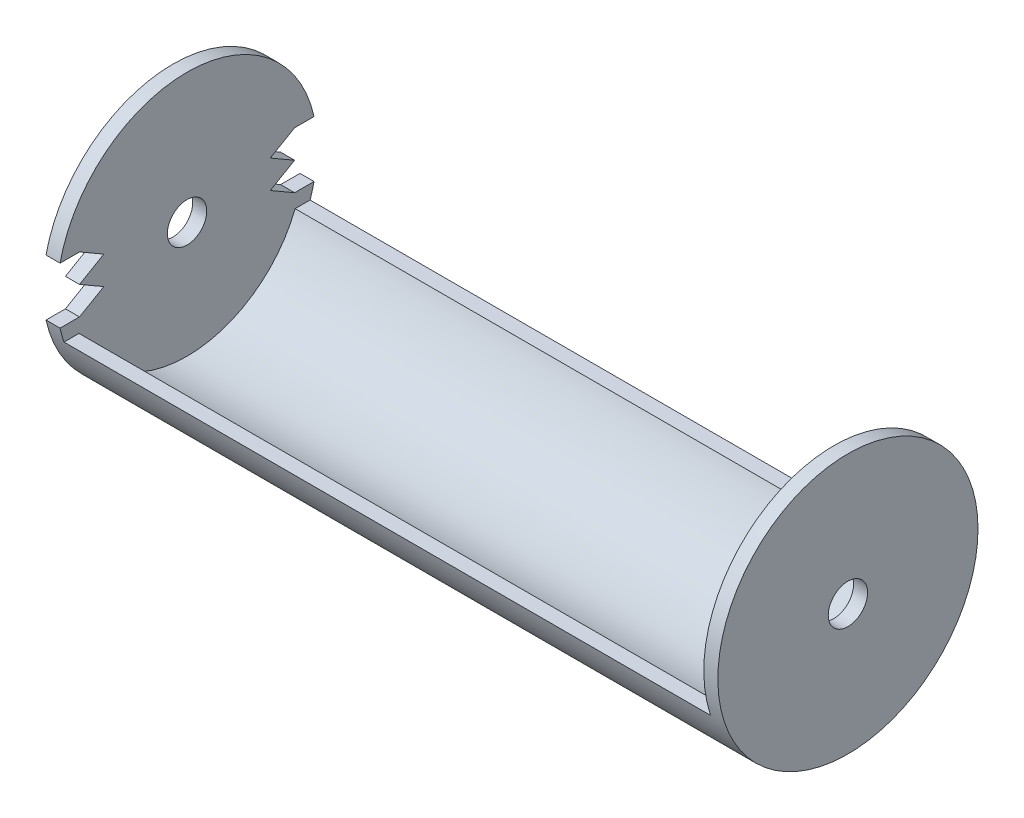
ISO-10303-21;
HEADER;
FILE_DESCRIPTION(('STEP AP214'),'2;1');
FILE_NAME('part.step','',(''),(''),'','','');
FILE_SCHEMA(('AUTOMOTIVE_DESIGN { 1 0 10303 214 1 1 1 1 }'));
ENDSEC;
DATA;
#1=APPLICATION_CONTEXT('core data for automotive mechanical design processes');
#2=APPLICATION_PROTOCOL_DEFINITION('international standard','automotive_design',2000,#1);
#3=PRODUCT_CONTEXT('',#1,'mechanical');
#4=PRODUCT('Part','Part','',(#3));
#5=PRODUCT_RELATED_PRODUCT_CATEGORY('part','',(#4));
#6=PRODUCT_DEFINITION_FORMATION('','',#4);
#7=PRODUCT_DEFINITION_CONTEXT('part definition',#1,'design');
#8=PRODUCT_DEFINITION('design','',#6,#7);
#9=PRODUCT_DEFINITION_SHAPE('','',#8);
#10=(LENGTH_UNIT() NAMED_UNIT(*) SI_UNIT(.MILLI.,.METRE.));
#11=(NAMED_UNIT(*) PLANE_ANGLE_UNIT() SI_UNIT($,.RADIAN.));
#12=(NAMED_UNIT(*) SI_UNIT($,.STERADIAN.) SOLID_ANGLE_UNIT());
#13=UNCERTAINTY_MEASURE_WITH_UNIT(LENGTH_MEASURE(1.E-05),#10,'distance_accuracy_value','');
#14=(GEOMETRIC_REPRESENTATION_CONTEXT(3) GLOBAL_UNCERTAINTY_ASSIGNED_CONTEXT((#13)) GLOBAL_UNIT_ASSIGNED_CONTEXT((#10,
#11,#12)) REPRESENTATION_CONTEXT('',''));
#15=CARTESIAN_POINT('',(0.,0.,0.));
#16=DIRECTION('',(0.,0.,1.));
#17=DIRECTION('',(1.,0.,0.));
#18=AXIS2_PLACEMENT_3D('',#15,#16,#17);
#19=CARTESIAN_POINT('',(-152.4,0.,0.));
#20=DIRECTION('',(1.,0.,0.));
#21=DIRECTION('',(0.,0.,-1.));
#22=AXIS2_PLACEMENT_3D('',#19,#20,#21);
#23=PLANE('',#22);
#24=CARTESIAN_POINT('',(-152.4,0.,0.));
#25=DIRECTION('',(1.,0.,0.));
#26=DIRECTION('',(0.,0.,-1.));
#27=AXIS2_PLACEMENT_3D('',#24,#25,#26);
#28=CIRCLE('',#27,8.89);
#29=CARTESIAN_POINT('',(-152.4,0.,8.89));
#30=VERTEX_POINT('',#29);
#31=EDGE_CURVE('E269',#30,#30,#28,.T.);
#32=ORIENTED_EDGE('',*,*,#31,.T.);
#33=EDGE_LOOP('',(#32));
#34=FACE_BOUND('',#33,.T.);
#35=DIRECTION('',(0.,0.,-1.));
#36=VECTOR('',#35,1.);
#37=CARTESIAN_POINT('',(-152.4,12.7,-48.5775));
#38=LINE('',#37,#36);
#39=CARTESIAN_POINT('',(-152.4,12.7,-48.5775));
#40=VERTEX_POINT('',#39);
#41=CARTESIAN_POINT('',(-152.4,12.7,-57.3480941814983));
#42=VERTEX_POINT('',#41);
#43=EDGE_CURVE('E183',#40,#42,#38,.T.);
#44=ORIENTED_EDGE('',*,*,#43,.F.);
#45=DIRECTION('',(0.,0.5,-0.866025403784439));
#46=VECTOR('',#45,1.);
#47=CARTESIAN_POINT('',(-152.4,12.7,-48.5775));
#48=LINE('',#47,#46);
#49=CARTESIAN_POINT('',(-152.4,6.34999999999999,-37.5789773719376));
#50=VERTEX_POINT('',#49);
#51=EDGE_CURVE('E172',#50,#40,#48,.T.);
#52=ORIENTED_EDGE('',*,*,#51,.F.);
#53=DIRECTION('',(0.,0.5,0.866025403784439));
#54=VECTOR('',#53,1.);
#55=CARTESIAN_POINT('',(-152.4,6.34999999999999,-37.5789773719376));
#56=LINE('',#55,#54);
#57=CARTESIAN_POINT('',(-152.4,0.,-48.5775));
#58=VERTEX_POINT('',#57);
#59=EDGE_CURVE('E192',#58,#50,#56,.T.);
#60=ORIENTED_EDGE('',*,*,#59,.F.);
#61=DIRECTION('',(0.,0.5,-0.866025403784438));
#62=VECTOR('',#61,1.);
#63=CARTESIAN_POINT('',(-152.4,0.,-48.5775));
#64=LINE('',#63,#62);
#65=CARTESIAN_POINT('',(-152.4,-6.35000000000001,-37.5789773719376));
#66=VERTEX_POINT('',#65);
#67=EDGE_CURVE('E186',#66,#58,#64,.T.);
#68=ORIENTED_EDGE('',*,*,#67,.F.);
#69=DIRECTION('',(0.,0.5,0.866025403784439));
#70=VECTOR('',#69,1.);
#71=CARTESIAN_POINT('',(-152.4,-6.35000000000001,-37.5789773719376));
#72=LINE('',#71,#70);
#73=CARTESIAN_POINT('',(-152.4,-12.7,-48.5775));
#74=VERTEX_POINT('',#73);
#75=EDGE_CURVE('E166',#74,#66,#72,.T.);
#76=ORIENTED_EDGE('',*,*,#75,.F.);
#77=DIRECTION('',(0.,0.,1.));
#78=VECTOR('',#77,1.);
#79=CARTESIAN_POINT('',(-152.4,-12.7,-48.5775));
#80=LINE('',#79,#78);
#81=CARTESIAN_POINT('',(-152.4,-12.7,-57.3480941814983));
#82=VERTEX_POINT('',#81);
#83=EDGE_CURVE('E180',#82,#74,#80,.T.);
#84=ORIENTED_EDGE('',*,*,#83,.F.);
#85=CARTESIAN_POINT('',(-152.4,0.,0.));
#86=DIRECTION('',(1.,0.,0.));
#87=DIRECTION('',(0.,0.,-1.));
#88=AXIS2_PLACEMENT_3D('',#85,#86,#87);
#89=CIRCLE('',#88,58.7375);
#90=CARTESIAN_POINT('',(-152.4,-12.7,57.3480941814983));
#91=VERTEX_POINT('',#90);
#92=EDGE_CURVE('E271',#91,#82,#89,.T.);
#93=ORIENTED_EDGE('',*,*,#92,.F.);
#94=DIRECTION('',(0.,0.,1.));
#95=VECTOR('',#94,1.);
#96=CARTESIAN_POINT('',(-152.4,-12.7,48.5775));
#97=LINE('',#96,#95);
#98=CARTESIAN_POINT('',(-152.4,-12.7,48.5775));
#99=VERTEX_POINT('',#98);
#100=EDGE_CURVE('E219',#99,#91,#97,.T.);
#101=ORIENTED_EDGE('',*,*,#100,.F.);
#102=DIRECTION('',(0.,-0.5,0.866025403784439));
#103=VECTOR('',#102,1.);
#104=CARTESIAN_POINT('',(-152.4,-6.35000000000001,37.5789773719376));
#105=LINE('',#104,#103);
#106=CARTESIAN_POINT('',(-152.4,-6.35000000000001,37.5789773719376));
#107=VERTEX_POINT('',#106);
#108=EDGE_CURVE('E222',#107,#99,#105,.T.);
#109=ORIENTED_EDGE('',*,*,#108,.F.);
#110=DIRECTION('',(0.,-0.5,-0.866025403784438));
#111=VECTOR('',#110,1.);
#112=CARTESIAN_POINT('',(-152.4,0.,48.5775));
#113=LINE('',#112,#111);
#114=CARTESIAN_POINT('',(-152.4,0.,48.5775));
#115=VERTEX_POINT('',#114);
#116=EDGE_CURVE('E221',#115,#107,#113,.T.);
#117=ORIENTED_EDGE('',*,*,#116,.F.);
#118=DIRECTION('',(0.,-0.5,0.866025403784439));
#119=VECTOR('',#118,1.);
#120=CARTESIAN_POINT('',(-152.4,6.34999999999999,37.5789773719376));
#121=LINE('',#120,#119);
#122=CARTESIAN_POINT('',(-152.4,6.34999999999999,37.5789773719376));
#123=VERTEX_POINT('',#122);
#124=EDGE_CURVE('E227',#123,#115,#121,.T.);
#125=ORIENTED_EDGE('',*,*,#124,.F.);
#126=DIRECTION('',(0.,-0.5,-0.866025403784439));
#127=VECTOR('',#126,1.);
#128=CARTESIAN_POINT('',(-152.4,12.7,48.5775));
#129=LINE('',#128,#127);
#130=CARTESIAN_POINT('',(-152.4,12.7,48.5775));
#131=VERTEX_POINT('',#130);
#132=EDGE_CURVE('E230',#131,#123,#129,.T.);
#133=ORIENTED_EDGE('',*,*,#132,.F.);
#134=DIRECTION('',(0.,0.,-1.));
#135=VECTOR('',#134,1.);
#136=CARTESIAN_POINT('',(-152.4,12.7,48.5775));
#137=LINE('',#136,#135);
#138=CARTESIAN_POINT('',(-152.4,12.7,57.3480941814983));
#139=VERTEX_POINT('',#138);
#140=EDGE_CURVE('E209',#139,#131,#137,.T.);
#141=ORIENTED_EDGE('',*,*,#140,.F.);
#142=EDGE_CURVE('E278',#42,#139,#89,.T.);
#143=ORIENTED_EDGE('',*,*,#142,.F.);
#144=EDGE_LOOP('',(#44,#52,#60,#68,#76,#84,#93,#101,#109,#117,#125,#133,#141,#143));
#145=FACE_BOUND('',#144,.T.);
#146=ADVANCED_FACE('F41',(#34,#145),#23,.F.);
#147=CARTESIAN_POINT('',(152.4,0.,0.));
#148=DIRECTION('',(-1.,0.,0.));
#149=DIRECTION('',(0.,0.,1.));
#150=AXIS2_PLACEMENT_3D('',#147,#148,#149);
#151=CYLINDRICAL_SURFACE('',#150,58.7375);
#152=CARTESIAN_POINT('',(152.4,0.,0.));
#153=DIRECTION('',(1.,0.,0.));
#154=DIRECTION('',(0.,0.,-1.));
#155=AXIS2_PLACEMENT_3D('',#152,#153,#154);
#156=CIRCLE('',#155,58.7375);
#157=CARTESIAN_POINT('',(152.4,0.,-58.7375));
#158=VERTEX_POINT('',#157);
#159=EDGE_CURVE('E277',#158,#158,#156,.T.);
#160=ORIENTED_EDGE('',*,*,#159,.F.);
#161=EDGE_LOOP('',(#160));
#162=FACE_BOUND('',#161,.T.);
#163=ORIENTED_EDGE('',*,*,#92,.T.);
#164=DIRECTION('',(-1.,0.,0.));
#165=VECTOR('',#164,1.);
#166=CARTESIAN_POINT('',(152.4,-12.7,-57.3480941814983));
#167=LINE('',#166,#165);
#168=CARTESIAN_POINT('',(-146.05,-12.7,-57.3480941814983));
#169=VERTEX_POINT('',#168);
#170=EDGE_CURVE('E179',#82,#169,#167,.F.);
#171=ORIENTED_EDGE('',*,*,#170,.T.);
#172=CARTESIAN_POINT('',(-146.05,0.,0.));
#173=DIRECTION('',(-1.,0.,0.));
#174=DIRECTION('',(0.,0.,1.));
#175=AXIS2_PLACEMENT_3D('',#172,#173,#174);
#176=CIRCLE('',#175,58.7375);
#177=CARTESIAN_POINT('',(-146.05,-19.05,-55.5625));
#178=VERTEX_POINT('',#177);
#179=EDGE_CURVE('E266',#169,#178,#176,.T.);
#180=ORIENTED_EDGE('',*,*,#179,.T.);
#181=DIRECTION('',(-1.,0.,0.));
#182=VECTOR('',#181,1.);
#183=CARTESIAN_POINT('',(152.4,-19.05,-55.5625));
#184=LINE('',#183,#182);
#185=CARTESIAN_POINT('',(146.05,-19.05,-55.5625));
#186=VERTEX_POINT('',#185);
#187=EDGE_CURVE('E290',#178,#186,#184,.F.);
#188=ORIENTED_EDGE('',*,*,#187,.T.);
#189=CARTESIAN_POINT('',(146.05,0.,0.));
#190=DIRECTION('',(1.,0.,0.));
#191=DIRECTION('',(0.,0.,-1.));
#192=AXIS2_PLACEMENT_3D('',#189,#190,#191);
#193=CIRCLE('',#192,58.7375);
#194=CARTESIAN_POINT('',(146.05,-19.05,55.5625));
#195=VERTEX_POINT('',#194);
#196=EDGE_CURVE('E258',#186,#195,#193,.T.);
#197=ORIENTED_EDGE('',*,*,#196,.T.);
#198=DIRECTION('',(-1.,0.,0.));
#199=VECTOR('',#198,1.);
#200=CARTESIAN_POINT('',(152.4,-19.05,55.5625));
#201=LINE('',#200,#199);
#202=CARTESIAN_POINT('',(-146.05,-19.05,55.5625));
#203=VERTEX_POINT('',#202);
#204=EDGE_CURVE('E276',#195,#203,#201,.T.);
#205=ORIENTED_EDGE('',*,*,#204,.T.);
#206=CARTESIAN_POINT('',(-146.05,-12.7,57.3480941814983));
#207=VERTEX_POINT('',#206);
#208=EDGE_CURVE('E264',#203,#207,#176,.T.);
#209=ORIENTED_EDGE('',*,*,#208,.T.);
#210=DIRECTION('',(-1.,0.,0.));
#211=VECTOR('',#210,1.);
#212=CARTESIAN_POINT('',(152.4,-12.7,57.3480941814983));
#213=LINE('',#212,#211);
#214=EDGE_CURVE('E202',#207,#91,#213,.T.);
#215=ORIENTED_EDGE('',*,*,#214,.T.);
#216=EDGE_LOOP('',(#163,#171,#180,#188,#197,#205,#209,#215));
#217=FACE_BOUND('',#216,.T.);
#218=ADVANCED_FACE('F43',(#162,#217),#151,.T.);
#219=CARTESIAN_POINT('',(-146.05,12.7,57.3480941814983));
#220=VERTEX_POINT('',#219);
#221=CARTESIAN_POINT('',(-146.05,12.7,-57.3480941814983));
#222=VERTEX_POINT('',#221);
#223=EDGE_CURVE('E270',#220,#222,#176,.T.);
#224=ORIENTED_EDGE('',*,*,#223,.T.);
#225=DIRECTION('',(-1.,0.,0.));
#226=VECTOR('',#225,1.);
#227=CARTESIAN_POINT('',(152.4,12.7,-57.3480941814983));
#228=LINE('',#227,#226);
#229=EDGE_CURVE('E238',#222,#42,#228,.T.);
#230=ORIENTED_EDGE('',*,*,#229,.T.);
#231=ORIENTED_EDGE('',*,*,#142,.T.);
#232=DIRECTION('',(-1.,0.,0.));
#233=VECTOR('',#232,1.);
#234=CARTESIAN_POINT('',(152.4,12.7,57.3480941814983));
#235=LINE('',#234,#233);
#236=EDGE_CURVE('E234',#139,#220,#235,.F.);
#237=ORIENTED_EDGE('',*,*,#236,.T.);
#238=EDGE_LOOP('',(#224,#230,#231,#237));
#239=FACE_BOUND('',#238,.T.);
#240=ADVANCED_FACE('F340',(#239),#151,.T.);
#241=CARTESIAN_POINT('',(-146.05,-19.05,-58.7375));
#242=DIRECTION('',(0.,-1.,0.));
#243=DIRECTION('',(0.,0.,-1.));
#244=AXIS2_PLACEMENT_3D('',#241,#242,#243);
#245=PLANE('',#244);
#246=DIRECTION('',(0.,0.,1.));
#247=VECTOR('',#246,1.);
#248=CARTESIAN_POINT('',(-146.05,-19.05,-58.7375));
#249=LINE('',#248,#247);
#250=CARTESIAN_POINT('',(-146.05,-19.05,-48.8011030228826));
#251=VERTEX_POINT('',#250);
#252=EDGE_CURVE('E260',#178,#251,#249,.T.);
#253=ORIENTED_EDGE('',*,*,#252,.T.);
#254=DIRECTION('',(-1.,0.,0.));
#255=VECTOR('',#254,1.);
#256=CARTESIAN_POINT('',(-152.4,-19.05,-48.8011030228826));
#257=LINE('',#256,#255);
#258=CARTESIAN_POINT('',(146.05,-19.05,-48.8011030228826));
#259=VERTEX_POINT('',#258);
#260=EDGE_CURVE('E247',#251,#259,#257,.F.);
#261=ORIENTED_EDGE('',*,*,#260,.T.);
#262=DIRECTION('',(0.,0.,1.));
#263=VECTOR('',#262,1.);
#264=CARTESIAN_POINT('',(146.05,-19.05,-58.7375));
#265=LINE('',#264,#263);
#266=EDGE_CURVE('E255',#186,#259,#265,.T.);
#267=ORIENTED_EDGE('',*,*,#266,.F.);
#268=ORIENTED_EDGE('',*,*,#187,.F.);
#269=EDGE_LOOP('',(#253,#261,#267,#268));
#270=FACE_BOUND('',#269,.T.);
#271=ADVANCED_FACE('F341',(#270),#245,.F.);
#272=CARTESIAN_POINT('',(152.4,0.,0.));
#273=DIRECTION('',(-1.,0.,0.));
#274=DIRECTION('',(0.,0.,1.));
#275=AXIS2_PLACEMENT_3D('',#272,#273,#274);
#276=CYLINDRICAL_SURFACE('',#275,8.89);
#277=CARTESIAN_POINT('',(-146.05,0.,0.));
#278=DIRECTION('',(-1.,0.,0.));
#279=DIRECTION('',(0.,0.,1.));
#280=AXIS2_PLACEMENT_3D('',#277,#278,#279);
#281=CIRCLE('',#280,8.89);
#282=CARTESIAN_POINT('',(-146.05,0.,8.89));
#283=VERTEX_POINT('',#282);
#284=EDGE_CURVE('E263',#283,#283,#281,.T.);
#285=CARTESIAN_POINT('',(-146.05,0.,8.89));
#286=CARTESIAN_POINT('',(-146.116145833333,0.,8.89));
#287=CARTESIAN_POINT('',(-146.182291666667,0.,8.89));
#288=CARTESIAN_POINT('',(-146.314583333333,0.,8.89));
#289=CARTESIAN_POINT('',(-146.380729166667,0.,8.89));
#290=CARTESIAN_POINT('',(-146.513020833333,0.,8.89));
#291=CARTESIAN_POINT('',(-146.579166666667,0.,8.89));
#292=CARTESIAN_POINT('',(-146.711458333333,0.,8.89));
#293=CARTESIAN_POINT('',(-146.777604166667,0.,8.89));
#294=CARTESIAN_POINT('',(-146.909895833333,0.,8.89));
#295=CARTESIAN_POINT('',(-146.976041666667,0.,8.89));
#296=CARTESIAN_POINT('',(-147.108333333333,0.,8.89));
#297=CARTESIAN_POINT('',(-147.174479166667,0.,8.89));
#298=CARTESIAN_POINT('',(-147.306770833333,0.,8.89));
#299=CARTESIAN_POINT('',(-147.372916666667,0.,8.89));
#300=CARTESIAN_POINT('',(-147.505208333333,0.,8.89));
#301=CARTESIAN_POINT('',(-147.571354166667,0.,8.89));
#302=CARTESIAN_POINT('',(-147.703645833333,0.,8.89));
#303=CARTESIAN_POINT('',(-147.769791666667,0.,8.89));
#304=CARTESIAN_POINT('',(-147.902083333333,0.,8.89));
#305=CARTESIAN_POINT('',(-147.968229166667,0.,8.89));
#306=CARTESIAN_POINT('',(-148.100520833333,0.,8.89));
#307=CARTESIAN_POINT('',(-148.166666666667,0.,8.89));
#308=CARTESIAN_POINT('',(-148.298958333333,0.,8.89));
#309=CARTESIAN_POINT('',(-148.365104166667,0.,8.89));
#310=CARTESIAN_POINT('',(-148.497395833333,0.,8.89));
#311=CARTESIAN_POINT('',(-148.563541666667,0.,8.89));
#312=CARTESIAN_POINT('',(-148.695833333333,0.,8.89));
#313=CARTESIAN_POINT('',(-148.761979166667,0.,8.89));
#314=CARTESIAN_POINT('',(-148.894270833333,0.,8.89));
#315=CARTESIAN_POINT('',(-148.960416666667,0.,8.89));
#316=CARTESIAN_POINT('',(-149.092708333333,0.,8.89));
#317=CARTESIAN_POINT('',(-149.158854166667,0.,8.89));
#318=CARTESIAN_POINT('',(-149.291145833333,0.,8.89));
#319=CARTESIAN_POINT('',(-149.357291666667,0.,8.89));
#320=CARTESIAN_POINT('',(-149.489583333333,0.,8.89));
#321=CARTESIAN_POINT('',(-149.555729166667,0.,8.89));
#322=CARTESIAN_POINT('',(-149.688020833333,0.,8.89));
#323=CARTESIAN_POINT('',(-149.754166666667,0.,8.89));
#324=CARTESIAN_POINT('',(-149.886458333333,0.,8.89));
#325=CARTESIAN_POINT('',(-149.952604166667,0.,8.89));
#326=CARTESIAN_POINT('',(-150.084895833333,0.,8.89));
#327=CARTESIAN_POINT('',(-150.151041666667,0.,8.89));
#328=CARTESIAN_POINT('',(-150.283333333333,0.,8.89));
#329=CARTESIAN_POINT('',(-150.349479166667,0.,8.89));
#330=CARTESIAN_POINT('',(-150.481770833333,0.,8.89));
#331=CARTESIAN_POINT('',(-150.547916666667,0.,8.89));
#332=CARTESIAN_POINT('',(-150.680208333333,0.,8.89));
#333=CARTESIAN_POINT('',(-150.746354166667,0.,8.89));
#334=CARTESIAN_POINT('',(-150.878645833333,0.,8.89));
#335=CARTESIAN_POINT('',(-150.944791666667,0.,8.89));
#336=CARTESIAN_POINT('',(-151.077083333333,0.,8.89));
#337=CARTESIAN_POINT('',(-151.143229166667,0.,8.89));
#338=CARTESIAN_POINT('',(-151.275520833333,0.,8.89));
#339=CARTESIAN_POINT('',(-151.341666666667,0.,8.89));
#340=CARTESIAN_POINT('',(-151.473958333333,0.,8.89));
#341=CARTESIAN_POINT('',(-151.540104166667,0.,8.89));
#342=CARTESIAN_POINT('',(-151.672395833333,0.,8.89));
#343=CARTESIAN_POINT('',(-151.738541666667,0.,8.89));
#344=CARTESIAN_POINT('',(-151.870833333333,0.,8.89));
#345=CARTESIAN_POINT('',(-151.936979166667,0.,8.89));
#346=CARTESIAN_POINT('',(-152.069270833333,0.,8.89));
#347=CARTESIAN_POINT('',(-152.135416666667,0.,8.89));
#348=CARTESIAN_POINT('',(-152.267708333333,0.,8.89));
#349=CARTESIAN_POINT('',(-152.333854166667,0.,8.89));
#350=CARTESIAN_POINT('',(-152.4,0.,8.89));
#351=B_SPLINE_CURVE_WITH_KNOTS('',3,(#285,#286,#287,#288,#289,#290,#291,#292,#293,#294,#295,
#296,#297,#298,#299,#300,#301,#302,#303,#304,#305,#306,#307,#308,#309,#310,#311,#312,#313,#314,
#315,#316,#317,#318,#319,#320,#321,#322,#323,#324,#325,#326,#327,#328,#329,#330,#331,#332,#333,
#334,#335,#336,#337,#338,#339,#340,#341,#342,#343,#344,#345,#346,#347,#348,#349,#350),
.UNSPECIFIED.,.F.,.F.,(4,2,2,2,2,2,2,2,2,2,2,2,2,2,2,2,2,2,2,2,2,2,2,2,2,2,2,2,2,2,2,2,4),(0.,
0.198437499999982,0.396875000000019,0.5953125,0.793750000000037,0.992187500000019,1.190625,
1.38906250000004,1.58750000000002,1.7859375,1.98437500000004,2.18281250000002,2.38125,
2.57968750000004,2.77812500000002,2.97656250000006,3.17500000000004,3.37343750000002,
3.57187500000006,3.77031250000004,3.96875000000008,4.16718750000006,4.36562500000004,
4.56406250000008,4.76250000000006,4.96093750000004,5.15937500000008,5.35781250000006,
5.55625000000004,5.75468750000008,5.95312500000006,6.1515625000001,6.35000000000008),.UNSPECIFIED.);
#352=EDGE_CURVE('BSEAM396',#283,#30,#351,.T.);
#353=ORIENTED_EDGE('',*,*,#284,.F.);
#354=ORIENTED_EDGE('',*,*,#31,.F.);
#355=ORIENTED_EDGE('',*,*,#352,.T.);
#356=ORIENTED_EDGE('',*,*,#352,.F.);
#357=EDGE_LOOP('',(#353,#355,#354,#356));
#358=FACE_BOUND('',#357,.T.);
#359=ADVANCED_FACE('F396',(#358),#276,.F.);
#360=CARTESIAN_POINT('',(152.4,0.,0.));
#361=DIRECTION('',(1.,0.,0.));
#362=DIRECTION('',(0.,0.,-1.));
#363=AXIS2_PLACEMENT_3D('',#360,#361,#362);
#364=PLANE('',#363);
#365=ORIENTED_EDGE('',*,*,#159,.T.);
#366=EDGE_LOOP('',(#365));
#367=FACE_BOUND('',#366,.T.);
#368=CARTESIAN_POINT('',(152.4,0.,0.));
#369=DIRECTION('',(1.,0.,0.));
#370=DIRECTION('',(0.,0.,-1.));
#371=AXIS2_PLACEMENT_3D('',#368,#369,#370);
#372=CIRCLE('',#371,8.89);
#373=CARTESIAN_POINT('',(152.4,0.,8.89));
#374=VERTEX_POINT('',#373);
#375=EDGE_CURVE('E268',#374,#374,#372,.T.);
#376=ORIENTED_EDGE('',*,*,#375,.F.);
#377=EDGE_LOOP('',(#376));
#378=FACE_BOUND('',#377,.T.);
#379=ADVANCED_FACE('F391',(#367,#378),#364,.T.);
#380=CARTESIAN_POINT('',(146.05,0.,0.));
#381=DIRECTION('',(1.,0.,0.));
#382=DIRECTION('',(0.,0.,-1.));
#383=AXIS2_PLACEMENT_3D('',#380,#381,#382);
#384=CIRCLE('',#383,8.89);
#385=CARTESIAN_POINT('',(146.05,0.,8.89));
#386=VERTEX_POINT('',#385);
#387=EDGE_CURVE('E253',#386,#386,#384,.T.);
#388=CARTESIAN_POINT('',(146.05,0.,8.89));
#389=CARTESIAN_POINT('',(146.116145833333,0.,8.89));
#390=CARTESIAN_POINT('',(146.182291666667,0.,8.89));
#391=CARTESIAN_POINT('',(146.314583333333,0.,8.89));
#392=CARTESIAN_POINT('',(146.380729166667,0.,8.89));
#393=CARTESIAN_POINT('',(146.513020833333,0.,8.89));
#394=CARTESIAN_POINT('',(146.579166666667,0.,8.89));
#395=CARTESIAN_POINT('',(146.711458333333,0.,8.89));
#396=CARTESIAN_POINT('',(146.777604166667,0.,8.89));
#397=CARTESIAN_POINT('',(146.909895833333,0.,8.89));
#398=CARTESIAN_POINT('',(146.976041666667,0.,8.89));
#399=CARTESIAN_POINT('',(147.108333333333,0.,8.89));
#400=CARTESIAN_POINT('',(147.174479166667,0.,8.89));
#401=CARTESIAN_POINT('',(147.306770833333,0.,8.89));
#402=CARTESIAN_POINT('',(147.372916666667,0.,8.89));
#403=CARTESIAN_POINT('',(147.505208333333,0.,8.89));
#404=CARTESIAN_POINT('',(147.571354166667,0.,8.89));
#405=CARTESIAN_POINT('',(147.703645833333,0.,8.89));
#406=CARTESIAN_POINT('',(147.769791666667,0.,8.89));
#407=CARTESIAN_POINT('',(147.902083333333,0.,8.89));
#408=CARTESIAN_POINT('',(147.968229166667,0.,8.89));
#409=CARTESIAN_POINT('',(148.100520833333,0.,8.89));
#410=CARTESIAN_POINT('',(148.166666666667,0.,8.89));
#411=CARTESIAN_POINT('',(148.298958333333,0.,8.89));
#412=CARTESIAN_POINT('',(148.365104166667,0.,8.89));
#413=CARTESIAN_POINT('',(148.497395833333,0.,8.89));
#414=CARTESIAN_POINT('',(148.563541666667,0.,8.89));
#415=CARTESIAN_POINT('',(148.695833333333,0.,8.89));
#416=CARTESIAN_POINT('',(148.761979166667,0.,8.89));
#417=CARTESIAN_POINT('',(148.894270833333,0.,8.89));
#418=CARTESIAN_POINT('',(148.960416666667,0.,8.89));
#419=CARTESIAN_POINT('',(149.092708333333,0.,8.89));
#420=CARTESIAN_POINT('',(149.158854166667,0.,8.89));
#421=CARTESIAN_POINT('',(149.291145833333,0.,8.89));
#422=CARTESIAN_POINT('',(149.357291666667,0.,8.89));
#423=CARTESIAN_POINT('',(149.489583333333,0.,8.89));
#424=CARTESIAN_POINT('',(149.555729166667,0.,8.89));
#425=CARTESIAN_POINT('',(149.688020833333,0.,8.89));
#426=CARTESIAN_POINT('',(149.754166666667,0.,8.89));
#427=CARTESIAN_POINT('',(149.886458333333,0.,8.89));
#428=CARTESIAN_POINT('',(149.952604166667,0.,8.89));
#429=CARTESIAN_POINT('',(150.084895833333,0.,8.89));
#430=CARTESIAN_POINT('',(150.151041666667,0.,8.89));
#431=CARTESIAN_POINT('',(150.283333333333,0.,8.89));
#432=CARTESIAN_POINT('',(150.349479166667,0.,8.89));
#433=CARTESIAN_POINT('',(150.481770833333,0.,8.89));
#434=CARTESIAN_POINT('',(150.547916666667,0.,8.89));
#435=CARTESIAN_POINT('',(150.680208333333,0.,8.89));
#436=CARTESIAN_POINT('',(150.746354166667,0.,8.89));
#437=CARTESIAN_POINT('',(150.878645833333,0.,8.89));
#438=CARTESIAN_POINT('',(150.944791666667,0.,8.89));
#439=CARTESIAN_POINT('',(151.077083333333,0.,8.89));
#440=CARTESIAN_POINT('',(151.143229166667,0.,8.89));
#441=CARTESIAN_POINT('',(151.275520833333,0.,8.89));
#442=CARTESIAN_POINT('',(151.341666666667,0.,8.89));
#443=CARTESIAN_POINT('',(151.473958333333,0.,8.89));
#444=CARTESIAN_POINT('',(151.540104166667,0.,8.89));
#445=CARTESIAN_POINT('',(151.672395833333,0.,8.89));
#446=CARTESIAN_POINT('',(151.738541666667,0.,8.89));
#447=CARTESIAN_POINT('',(151.870833333333,0.,8.89));
#448=CARTESIAN_POINT('',(151.936979166667,0.,8.89));
#449=CARTESIAN_POINT('',(152.069270833333,0.,8.89));
#450=CARTESIAN_POINT('',(152.135416666667,0.,8.89));
#451=CARTESIAN_POINT('',(152.267708333333,0.,8.89));
#452=CARTESIAN_POINT('',(152.333854166667,0.,8.89));
#453=CARTESIAN_POINT('',(152.4,0.,8.89));
#454=B_SPLINE_CURVE_WITH_KNOTS('',3,(#388,#389,#390,#391,#392,#393,#394,#395,#396,#397,#398,
#399,#400,#401,#402,#403,#404,#405,#406,#407,#408,#409,#410,#411,#412,#413,#414,#415,#416,#417,
#418,#419,#420,#421,#422,#423,#424,#425,#426,#427,#428,#429,#430,#431,#432,#433,#434,#435,#436,
#437,#438,#439,#440,#441,#442,#443,#444,#445,#446,#447,#448,#449,#450,#451,#452,#453),
.UNSPECIFIED.,.F.,.F.,(4,2,2,2,2,2,2,2,2,2,2,2,2,2,2,2,2,2,2,2,2,2,2,2,2,2,2,2,2,2,2,2,4),(0.,
0.198437500000009,0.396875000000019,0.5953125,0.79375000000001,0.992187500000019,1.190625,
1.38906250000001,1.58750000000002,1.7859375,1.98437500000001,2.18281250000002,2.38125,
2.57968750000001,2.77812500000002,2.9765625,3.17500000000001,3.37343750000002,3.571875,
3.77031250000001,3.96875000000002,4.1671875,4.36562500000001,4.56406250000002,4.7625,
4.96093750000001,5.15937500000002,5.3578125,5.55625000000001,5.75468750000002,5.953125,
6.15156250000001,6.35000000000002),.UNSPECIFIED.);
#455=EDGE_CURVE('BSEAM400',#386,#374,#454,.T.);
#456=ORIENTED_EDGE('',*,*,#387,.F.);
#457=ORIENTED_EDGE('',*,*,#375,.T.);
#458=ORIENTED_EDGE('',*,*,#455,.T.);
#459=ORIENTED_EDGE('',*,*,#455,.F.);
#460=EDGE_LOOP('',(#456,#458,#457,#459));
#461=FACE_BOUND('',#460,.T.);
#462=ADVANCED_FACE('F400',(#461),#276,.F.);
#463=CARTESIAN_POINT('',(146.05,-19.05,48.8011030228826));
#464=VERTEX_POINT('',#463);
#465=EDGE_CURVE('E257',#464,#195,#265,.T.);
#466=ORIENTED_EDGE('',*,*,#465,.F.);
#467=DIRECTION('',(-1.,0.,0.));
#468=VECTOR('',#467,1.);
#469=CARTESIAN_POINT('',(152.4,-19.05,48.8011030228826));
#470=LINE('',#469,#468);
#471=CARTESIAN_POINT('',(-146.05,-19.05,48.8011030228826));
#472=VERTEX_POINT('',#471);
#473=EDGE_CURVE('E244',#464,#472,#470,.T.);
#474=ORIENTED_EDGE('',*,*,#473,.T.);
#475=EDGE_CURVE('E252',#472,#203,#249,.T.);
#476=ORIENTED_EDGE('',*,*,#475,.T.);
#477=ORIENTED_EDGE('',*,*,#204,.F.);
#478=EDGE_LOOP('',(#466,#474,#476,#477));
#479=FACE_BOUND('',#478,.T.);
#480=ADVANCED_FACE('F358',(#479),#245,.F.);
#481=CARTESIAN_POINT('',(-146.05,58.7375,-58.7375));
#482=DIRECTION('',(-1.,0.,0.));
#483=DIRECTION('',(0.,0.,1.));
#484=AXIS2_PLACEMENT_3D('',#481,#482,#483);
#485=PLANE('',#484);
#486=DIRECTION('',(0.,0.5,-0.866025403784439));
#487=VECTOR('',#486,1.);
#488=CARTESIAN_POINT('',(-146.05,28.6087840512249,-76.1323222633631));
#489=LINE('',#488,#487);
#490=CARTESIAN_POINT('',(-146.05,6.34999999999999,-37.5789773719376));
#491=VERTEX_POINT('',#490);
#492=CARTESIAN_POINT('',(-146.05,12.7,-48.5775));
#493=VERTEX_POINT('',#492);
#494=EDGE_CURVE('E47',#491,#493,#489,.T.);
#495=ORIENTED_EDGE('',*,*,#494,.T.);
#496=DIRECTION('',(0.,0.,-1.));
#497=VECTOR('',#496,1.);
#498=CARTESIAN_POINT('',(-146.05,12.7,-58.7374999999999));
#499=LINE('',#498,#497);
#500=EDGE_CURVE('E11',#493,#222,#499,.T.);
#501=ORIENTED_EDGE('',*,*,#500,.T.);
#502=ORIENTED_EDGE('',*,*,#223,.F.);
#503=DIRECTION('',(0.,0.,-1.));
#504=VECTOR('',#503,1.);
#505=CARTESIAN_POINT('',(-146.05,12.7000000000001,-58.7375));
#506=LINE('',#505,#504);
#507=CARTESIAN_POINT('',(-146.05,12.7,48.5775));
#508=VERTEX_POINT('',#507);
#509=EDGE_CURVE('E306',#220,#508,#506,.T.);
#510=ORIENTED_EDGE('',*,*,#509,.T.);
#511=DIRECTION('',(0.,-0.5,-0.866025403784439));
#512=VECTOR('',#511,1.);
#513=CARTESIAN_POINT('',(-146.05,-22.2593831035635,-11.9739277366369));
#514=LINE('',#513,#512);
#515=CARTESIAN_POINT('',(-146.05,6.34999999999999,37.5789773719376));
#516=VERTEX_POINT('',#515);
#517=EDGE_CURVE('E303',#508,#516,#514,.T.);
#518=ORIENTED_EDGE('',*,*,#517,.T.);
#519=DIRECTION('',(0.,-0.5,0.866025403784439));
#520=VECTOR('',#519,1.);
#521=CARTESIAN_POINT('',(-146.05,61.1531331035635,-57.3428335773942));
#522=LINE('',#521,#520);
#523=CARTESIAN_POINT('',(-146.05,0.,48.5775));
#524=VERTEX_POINT('',#523);
#525=EDGE_CURVE('E293',#516,#524,#522,.T.);
#526=ORIENTED_EDGE('',*,*,#525,.T.);
#527=DIRECTION('',(0.,-0.5,-0.866025403784439));
#528=VECTOR('',#527,1.);
#529=CARTESIAN_POINT('',(-146.05,-31.7843831035635,-6.47466642260573));
#530=LINE('',#529,#528);
#531=CARTESIAN_POINT('',(-146.05,-6.35000000000001,37.5789773719376));
#532=VERTEX_POINT('',#531);
#533=EDGE_CURVE('E295',#524,#532,#530,.T.);
#534=ORIENTED_EDGE('',*,*,#533,.T.);
#535=DIRECTION('',(0.,-0.5,0.866025403784439));
#536=VECTOR('',#535,1.);
#537=CARTESIAN_POINT('',(-146.05,51.6281331035635,-62.8420948914254));
#538=LINE('',#537,#536);
#539=CARTESIAN_POINT('',(-146.05,-12.7,48.5775));
#540=VERTEX_POINT('',#539);
#541=EDGE_CURVE('E300',#532,#540,#538,.T.);
#542=ORIENTED_EDGE('',*,*,#541,.T.);
#543=DIRECTION('',(0.,0.,1.));
#544=VECTOR('',#543,1.);
#545=CARTESIAN_POINT('',(-146.05,-12.7,-58.7375));
#546=LINE('',#545,#544);
#547=EDGE_CURVE('E297',#540,#207,#546,.T.);
#548=ORIENTED_EDGE('',*,*,#547,.T.);
#549=ORIENTED_EDGE('',*,*,#208,.F.);
#550=ORIENTED_EDGE('',*,*,#475,.F.);
#551=CARTESIAN_POINT('',(-146.05,0.,0.));
#552=DIRECTION('',(1.,0.,0.));
#553=DIRECTION('',(0.,0.,-1.));
#554=AXIS2_PLACEMENT_3D('',#551,#552,#553);
#555=CIRCLE('',#554,52.3875);
#556=EDGE_CURVE('E241',#472,#251,#555,.T.);
#557=ORIENTED_EDGE('',*,*,#556,.T.);
#558=ORIENTED_EDGE('',*,*,#252,.F.);
#559=ORIENTED_EDGE('',*,*,#179,.F.);
#560=DIRECTION('',(0.,0.,1.));
#561=VECTOR('',#560,1.);
#562=CARTESIAN_POINT('',(-146.05,-12.7,-58.7375));
#563=LINE('',#562,#561);
#564=CARTESIAN_POINT('',(-146.05,-12.7,-48.5775));
#565=VERTEX_POINT('',#564);
#566=EDGE_CURVE('E307',#169,#565,#563,.T.);
#567=ORIENTED_EDGE('',*,*,#566,.T.);
#568=DIRECTION('',(0.,0.5,0.866025403784439));
#569=VECTOR('',#568,1.);
#570=CARTESIAN_POINT('',(-146.05,0.759965948775039,-25.2641551085746));
#571=LINE('',#570,#569);
#572=CARTESIAN_POINT('',(-146.05,-6.35000000000001,-37.5789773719376));
#573=VERTEX_POINT('',#572);
#574=EDGE_CURVE('E171',#565,#573,#571,.T.);
#575=ORIENTED_EDGE('',*,*,#574,.T.);
#576=DIRECTION('',(0.,0.5,-0.866025403784439));
#577=VECTOR('',#576,1.);
#578=CARTESIAN_POINT('',(-146.05,19.083784051225,-81.6315835773943));
#579=LINE('',#578,#577);
#580=CARTESIAN_POINT('',(-146.05,0.,-48.5775));
#581=VERTEX_POINT('',#580);
#582=EDGE_CURVE('E315',#573,#581,#579,.T.);
#583=ORIENTED_EDGE('',*,*,#582,.T.);
#584=DIRECTION('',(0.,0.5,0.866025403784439));
#585=VECTOR('',#584,1.);
#586=CARTESIAN_POINT('',(-146.05,10.2849659487751,-30.7634164226058));
#587=LINE('',#586,#585);
#588=EDGE_CURVE('E314',#581,#491,#587,.T.);
#589=ORIENTED_EDGE('',*,*,#588,.T.);
#590=EDGE_LOOP('',(#495,#501,#502,#510,#518,#526,#534,#542,#548,#549,#550,#557,#558,#559,#567,
#575,#583,#589));
#591=FACE_BOUND('',#590,.T.);
#592=ORIENTED_EDGE('',*,*,#284,.T.);
#593=EDGE_LOOP('',(#592));
#594=FACE_BOUND('',#593,.T.);
#595=ADVANCED_FACE('F316',(#591,#594),#485,.F.);
#596=CARTESIAN_POINT('',(146.05,58.7375,-58.7375));
#597=DIRECTION('',(1.,0.,0.));
#598=DIRECTION('',(0.,0.,-1.));
#599=AXIS2_PLACEMENT_3D('',#596,#597,#598);
#600=PLANE('',#599);
#601=ORIENTED_EDGE('',*,*,#387,.T.);
#602=EDGE_LOOP('',(#601));
#603=FACE_BOUND('',#602,.T.);
#604=ORIENTED_EDGE('',*,*,#196,.F.);
#605=ORIENTED_EDGE('',*,*,#266,.T.);
#606=CARTESIAN_POINT('',(146.05,0.,0.));
#607=DIRECTION('',(1.,0.,0.));
#608=DIRECTION('',(0.,0.,-1.));
#609=AXIS2_PLACEMENT_3D('',#606,#607,#608);
#610=CIRCLE('',#609,52.3875);
#611=EDGE_CURVE('E243',#464,#259,#610,.T.);
#612=ORIENTED_EDGE('',*,*,#611,.F.);
#613=ORIENTED_EDGE('',*,*,#465,.T.);
#614=EDGE_LOOP('',(#604,#605,#612,#613));
#615=FACE_BOUND('',#614,.T.);
#616=ADVANCED_FACE('F354',(#603,#615),#600,.F.);
#617=CARTESIAN_POINT('',(152.4,0.,0.));
#618=DIRECTION('',(-1.,0.,0.));
#619=DIRECTION('',(0.,0.,1.));
#620=AXIS2_PLACEMENT_3D('',#617,#618,#619);
#621=CYLINDRICAL_SURFACE('',#620,52.3875);
#622=ORIENTED_EDGE('',*,*,#473,.F.);
#623=ORIENTED_EDGE('',*,*,#611,.T.);
#624=ORIENTED_EDGE('',*,*,#260,.F.);
#625=ORIENTED_EDGE('',*,*,#556,.F.);
#626=EDGE_LOOP('',(#622,#623,#624,#625));
#627=FACE_BOUND('',#626,.T.);
#628=ADVANCED_FACE('F349',(#627),#621,.F.);
#629=CARTESIAN_POINT('',(-139.7,12.7,48.5775));
#630=DIRECTION('',(0.,0.866025403784439,-0.5));
#631=DIRECTION('',(0.,0.5,0.866025403784439));
#632=AXIS2_PLACEMENT_3D('',#629,#630,#631);
#633=PLANE('',#632);
#634=DIRECTION('',(-1.,0.,0.));
#635=VECTOR('',#634,1.);
#636=CARTESIAN_POINT('',(-139.7,12.7,48.5775));
#637=LINE('',#636,#635);
#638=EDGE_CURVE('E213',#508,#131,#637,.T.);
#639=ORIENTED_EDGE('',*,*,#638,.T.);
#640=ORIENTED_EDGE('',*,*,#132,.T.);
#641=DIRECTION('',(-1.,0.,0.));
#642=VECTOR('',#641,1.);
#643=CARTESIAN_POINT('',(-139.7,6.34999999999999,37.5789773719376));
#644=LINE('',#643,#642);
#645=EDGE_CURVE('E210',#516,#123,#644,.T.);
#646=ORIENTED_EDGE('',*,*,#645,.F.);
#647=ORIENTED_EDGE('',*,*,#517,.F.);
#648=EDGE_LOOP('',(#639,#640,#646,#647));
#649=FACE_BOUND('',#648,.T.);
#650=ADVANCED_FACE('F373',(#649),#633,.F.);
#651=CARTESIAN_POINT('',(-139.7,12.7,48.5775));
#652=DIRECTION('',(0.,1.,0.));
#653=DIRECTION('',(0.,0.,1.));
#654=AXIS2_PLACEMENT_3D('',#651,#652,#653);
#655=PLANE('',#654);
#656=ORIENTED_EDGE('',*,*,#140,.T.);
#657=ORIENTED_EDGE('',*,*,#638,.F.);
#658=ORIENTED_EDGE('',*,*,#509,.F.);
#659=ORIENTED_EDGE('',*,*,#236,.F.);
#660=EDGE_LOOP('',(#656,#657,#658,#659));
#661=FACE_BOUND('',#660,.T.);
#662=ADVANCED_FACE('F376',(#661),#655,.F.);
#663=CARTESIAN_POINT('',(-139.7,-12.7,48.5775));
#664=DIRECTION('',(0.,-1.,0.));
#665=DIRECTION('',(0.,0.,-1.));
#666=AXIS2_PLACEMENT_3D('',#663,#664,#665);
#667=PLANE('',#666);
#668=ORIENTED_EDGE('',*,*,#547,.F.);
#669=DIRECTION('',(-1.,0.,0.));
#670=VECTOR('',#669,1.);
#671=CARTESIAN_POINT('',(-139.7,-12.7,48.5775));
#672=LINE('',#671,#670);
#673=EDGE_CURVE('E214',#540,#99,#672,.T.);
#674=ORIENTED_EDGE('',*,*,#673,.T.);
#675=ORIENTED_EDGE('',*,*,#100,.T.);
#676=ORIENTED_EDGE('',*,*,#214,.F.);
#677=EDGE_LOOP('',(#668,#674,#675,#676));
#678=FACE_BOUND('',#677,.T.);
#679=ADVANCED_FACE('F363',(#678),#667,.F.);
#680=CARTESIAN_POINT('',(-139.7,-6.35000000000001,37.5789773719376));
#681=DIRECTION('',(0.,-0.866025403784439,-0.5));
#682=DIRECTION('',(0.,0.5,-0.866025403784439));
#683=AXIS2_PLACEMENT_3D('',#680,#681,#682);
#684=PLANE('',#683);
#685=DIRECTION('',(-1.,0.,0.));
#686=VECTOR('',#685,1.);
#687=CARTESIAN_POINT('',(-139.7,-6.35000000000001,37.5789773719376));
#688=LINE('',#687,#686);
#689=EDGE_CURVE('E212',#532,#107,#688,.T.);
#690=ORIENTED_EDGE('',*,*,#689,.T.);
#691=ORIENTED_EDGE('',*,*,#108,.T.);
#692=ORIENTED_EDGE('',*,*,#673,.F.);
#693=ORIENTED_EDGE('',*,*,#541,.F.);
#694=EDGE_LOOP('',(#690,#691,#692,#693));
#695=FACE_BOUND('',#694,.T.);
#696=ADVANCED_FACE('F364',(#695),#684,.F.);
#697=CARTESIAN_POINT('',(-139.7,0.,48.5775));
#698=DIRECTION('',(0.,0.866025403784439,-0.5));
#699=DIRECTION('',(0.,0.5,0.866025403784439));
#700=AXIS2_PLACEMENT_3D('',#697,#698,#699);
#701=PLANE('',#700);
#702=DIRECTION('',(-1.,0.,0.));
#703=VECTOR('',#702,1.);
#704=CARTESIAN_POINT('',(-139.7,0.,48.5775));
#705=LINE('',#704,#703);
#706=EDGE_CURVE('E61',#524,#115,#705,.T.);
#707=ORIENTED_EDGE('',*,*,#706,.T.);
#708=ORIENTED_EDGE('',*,*,#116,.T.);
#709=ORIENTED_EDGE('',*,*,#689,.F.);
#710=ORIENTED_EDGE('',*,*,#533,.F.);
#711=EDGE_LOOP('',(#707,#708,#709,#710));
#712=FACE_BOUND('',#711,.T.);
#713=ADVANCED_FACE('F370',(#712),#701,.F.);
#714=CARTESIAN_POINT('',(-139.7,6.34999999999999,37.5789773719376));
#715=DIRECTION('',(0.,-0.866025403784439,-0.5));
#716=DIRECTION('',(0.,0.5,-0.866025403784439));
#717=AXIS2_PLACEMENT_3D('',#714,#715,#716);
#718=PLANE('',#717);
#719=ORIENTED_EDGE('',*,*,#645,.T.);
#720=ORIENTED_EDGE('',*,*,#124,.T.);
#721=ORIENTED_EDGE('',*,*,#706,.F.);
#722=ORIENTED_EDGE('',*,*,#525,.F.);
#723=EDGE_LOOP('',(#719,#720,#721,#722));
#724=FACE_BOUND('',#723,.T.);
#725=ADVANCED_FACE('F369',(#724),#718,.F.);
#726=CARTESIAN_POINT('',(-139.7,12.7,-48.5775));
#727=DIRECTION('',(0.,1.,0.));
#728=DIRECTION('',(0.,0.,1.));
#729=AXIS2_PLACEMENT_3D('',#726,#727,#728);
#730=PLANE('',#729);
#731=ORIENTED_EDGE('',*,*,#500,.F.);
#732=DIRECTION('',(-1.,0.,0.));
#733=VECTOR('',#732,1.);
#734=CARTESIAN_POINT('',(-139.7,12.7,-48.5775));
#735=LINE('',#734,#733);
#736=EDGE_CURVE('E199',#493,#40,#735,.T.);
#737=ORIENTED_EDGE('',*,*,#736,.T.);
#738=ORIENTED_EDGE('',*,*,#43,.T.);
#739=ORIENTED_EDGE('',*,*,#229,.F.);
#740=EDGE_LOOP('',(#731,#737,#738,#739));
#741=FACE_BOUND('',#740,.T.);
#742=ADVANCED_FACE('F333',(#741),#730,.F.);
#743=CARTESIAN_POINT('',(-139.7,12.7,-48.5775));
#744=DIRECTION('',(0.,0.866025403784439,0.5));
#745=DIRECTION('',(0.,-0.5,0.866025403784439));
#746=AXIS2_PLACEMENT_3D('',#743,#744,#745);
#747=PLANE('',#746);
#748=DIRECTION('',(-1.,0.,0.));
#749=VECTOR('',#748,1.);
#750=CARTESIAN_POINT('',(-139.7,6.34999999999999,-37.5789773719376));
#751=LINE('',#750,#749);
#752=EDGE_CURVE('E204',#491,#50,#751,.T.);
#753=ORIENTED_EDGE('',*,*,#752,.T.);
#754=ORIENTED_EDGE('',*,*,#51,.T.);
#755=ORIENTED_EDGE('',*,*,#736,.F.);
#756=ORIENTED_EDGE('',*,*,#494,.F.);
#757=EDGE_LOOP('',(#753,#754,#755,#756));
#758=FACE_BOUND('',#757,.T.);
#759=ADVANCED_FACE('F327',(#758),#747,.F.);
#760=CARTESIAN_POINT('',(-139.7,6.34999999999999,-37.5789773719376));
#761=DIRECTION('',(0.,-0.866025403784439,0.5));
#762=DIRECTION('',(0.,-0.5,-0.866025403784439));
#763=AXIS2_PLACEMENT_3D('',#760,#761,#762);
#764=PLANE('',#763);
#765=DIRECTION('',(-1.,0.,0.));
#766=VECTOR('',#765,1.);
#767=CARTESIAN_POINT('',(-139.7,0.,-48.5775));
#768=LINE('',#767,#766);
#769=EDGE_CURVE('E201',#581,#58,#768,.T.);
#770=ORIENTED_EDGE('',*,*,#769,.T.);
#771=ORIENTED_EDGE('',*,*,#59,.T.);
#772=ORIENTED_EDGE('',*,*,#752,.F.);
#773=ORIENTED_EDGE('',*,*,#588,.F.);
#774=EDGE_LOOP('',(#770,#771,#772,#773));
#775=FACE_BOUND('',#774,.T.);
#776=ADVANCED_FACE('F328',(#775),#764,.F.);
#777=CARTESIAN_POINT('',(-139.7,0.,-48.5775));
#778=DIRECTION('',(0.,0.866025403784439,0.5));
#779=DIRECTION('',(0.,-0.5,0.866025403784439));
#780=AXIS2_PLACEMENT_3D('',#777,#778,#779);
#781=PLANE('',#780);
#782=DIRECTION('',(-1.,0.,0.));
#783=VECTOR('',#782,1.);
#784=CARTESIAN_POINT('',(-139.7,-6.35000000000001,-37.5789773719376));
#785=LINE('',#784,#783);
#786=EDGE_CURVE('E173',#573,#66,#785,.T.);
#787=ORIENTED_EDGE('',*,*,#786,.T.);
#788=ORIENTED_EDGE('',*,*,#67,.T.);
#789=ORIENTED_EDGE('',*,*,#769,.F.);
#790=ORIENTED_EDGE('',*,*,#582,.F.);
#791=EDGE_LOOP('',(#787,#788,#789,#790));
#792=FACE_BOUND('',#791,.T.);
#793=ADVANCED_FACE('F500',(#792),#781,.F.);
#794=CARTESIAN_POINT('',(-139.7,-6.35000000000001,-37.5789773719376));
#795=DIRECTION('',(0.,-0.866025403784439,0.5));
#796=DIRECTION('',(0.,-0.5,-0.866025403784439));
#797=AXIS2_PLACEMENT_3D('',#794,#795,#796);
#798=PLANE('',#797);
#799=DIRECTION('',(-1.,0.,0.));
#800=VECTOR('',#799,1.);
#801=CARTESIAN_POINT('',(-139.7,-12.7,-48.5775));
#802=LINE('',#801,#800);
#803=EDGE_CURVE('E57',#565,#74,#802,.T.);
#804=ORIENTED_EDGE('',*,*,#803,.T.);
#805=ORIENTED_EDGE('',*,*,#75,.T.);
#806=ORIENTED_EDGE('',*,*,#786,.F.);
#807=ORIENTED_EDGE('',*,*,#574,.F.);
#808=EDGE_LOOP('',(#804,#805,#806,#807));
#809=FACE_BOUND('',#808,.T.);
#810=ADVANCED_FACE('F164',(#809),#798,.F.);
#811=CARTESIAN_POINT('',(-139.7,-12.7,-48.5775));
#812=DIRECTION('',(0.,-1.,0.));
#813=DIRECTION('',(0.,0.,-1.));
#814=AXIS2_PLACEMENT_3D('',#811,#812,#813);
#815=PLANE('',#814);
#816=ORIENTED_EDGE('',*,*,#83,.T.);
#817=ORIENTED_EDGE('',*,*,#803,.F.);
#818=ORIENTED_EDGE('',*,*,#566,.F.);
#819=ORIENTED_EDGE('',*,*,#170,.F.);
#820=EDGE_LOOP('',(#816,#817,#818,#819));
#821=FACE_BOUND('',#820,.T.);
#822=ADVANCED_FACE('F178',(#821),#815,.F.);
#823=CLOSED_SHELL('',(#146,#218,#240,#271,#359,#379,#462,#480,#595,#616,#628,#650,#662,#679,
#696,#713,#725,#742,#759,#776,#793,#810,#822));
#824=MANIFOLD_SOLID_BREP('B2',#823);
#825=ADVANCED_BREP_SHAPE_REPRESENTATION('',(#18,#824),#14);
#826=SHAPE_DEFINITION_REPRESENTATION(#9,#825);
ENDSEC;
END-ISO-10303-21;
